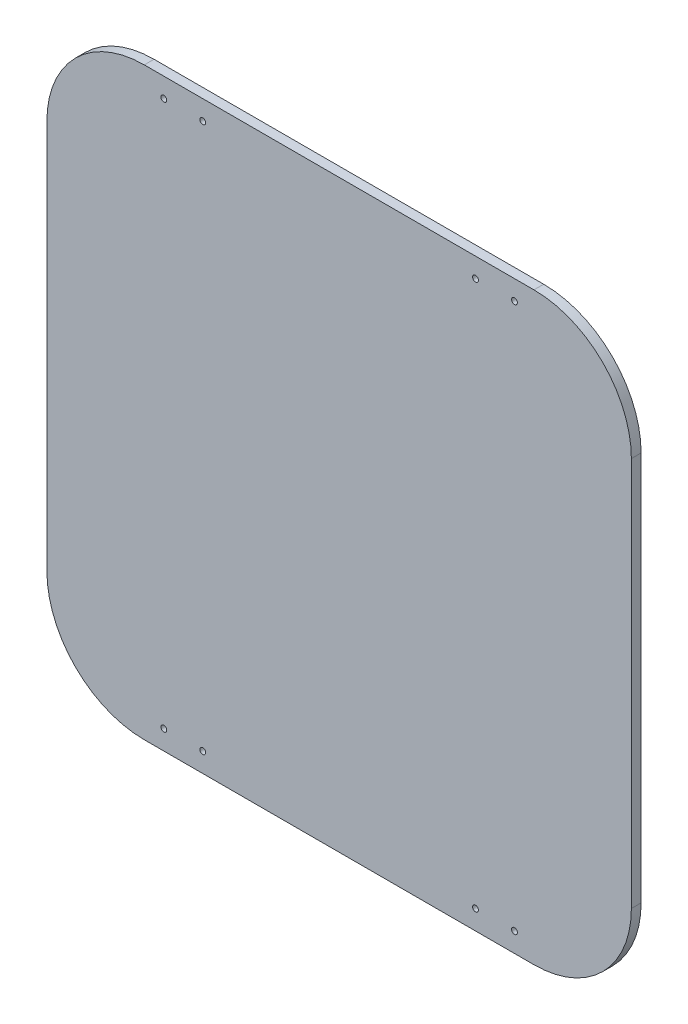
ISO-10303-21;
HEADER;
FILE_DESCRIPTION(('STEP AP214'),'2;1');
FILE_NAME('part.step','',(''),(''),'','','');
FILE_SCHEMA(('AUTOMOTIVE_DESIGN { 1 0 10303 214 1 1 1 1 }'));
ENDSEC;
DATA;
#1=APPLICATION_CONTEXT('core data for automotive mechanical design processes');
#2=APPLICATION_PROTOCOL_DEFINITION('international standard','automotive_design',2000,#1);
#3=PRODUCT_CONTEXT('',#1,'mechanical');
#4=PRODUCT('Part','Part','',(#3));
#5=PRODUCT_RELATED_PRODUCT_CATEGORY('part','',(#4));
#6=PRODUCT_DEFINITION_FORMATION('','',#4);
#7=PRODUCT_DEFINITION_CONTEXT('part definition',#1,'design');
#8=PRODUCT_DEFINITION('design','',#6,#7);
#9=PRODUCT_DEFINITION_SHAPE('','',#8);
#10=(LENGTH_UNIT() NAMED_UNIT(*) SI_UNIT(.MILLI.,.METRE.));
#11=(NAMED_UNIT(*) PLANE_ANGLE_UNIT() SI_UNIT($,.RADIAN.));
#12=(NAMED_UNIT(*) SI_UNIT($,.STERADIAN.) SOLID_ANGLE_UNIT());
#13=UNCERTAINTY_MEASURE_WITH_UNIT(LENGTH_MEASURE(1.E-05),#10,'distance_accuracy_value','');
#14=(GEOMETRIC_REPRESENTATION_CONTEXT(3) GLOBAL_UNCERTAINTY_ASSIGNED_CONTEXT((#13)) GLOBAL_UNIT_ASSIGNED_CONTEXT((#10,
#11,#12)) REPRESENTATION_CONTEXT('',''));
#15=CARTESIAN_POINT('',(0.,0.,0.));
#16=DIRECTION('',(0.,0.,1.));
#17=DIRECTION('',(1.,0.,0.));
#18=AXIS2_PLACEMENT_3D('',#15,#16,#17);
#19=CARTESIAN_POINT('',(-100.,-99.9999999999999,5.));
#20=DIRECTION('',(0.,0.,1.));
#21=DIRECTION('',(1.,0.,0.));
#22=AXIS2_PLACEMENT_3D('',#19,#20,#21);
#23=PLANE('',#22);
#24=CARTESIAN_POINT('',(-89.9999999999999,-140.,5.));
#25=DIRECTION('',(0.,0.,1.));
#26=DIRECTION('',(1.,0.,0.));
#27=AXIS2_PLACEMENT_3D('',#24,#25,#26);
#28=CIRCLE('',#27,1.5);
#29=CARTESIAN_POINT('',(-88.4999999999999,-140.,5.));
#30=VERTEX_POINT('',#29);
#31=EDGE_CURVE('E213',#30,#30,#28,.T.);
#32=ORIENTED_EDGE('',*,*,#31,.F.);
#33=EDGE_LOOP('',(#32));
#34=FACE_BOUND('',#33,.T.);
#35=CARTESIAN_POINT('',(70.,-140.,5.));
#36=DIRECTION('',(0.,0.,1.));
#37=DIRECTION('',(1.,0.,0.));
#38=AXIS2_PLACEMENT_3D('',#35,#36,#37);
#39=CIRCLE('',#38,1.5);
#40=CARTESIAN_POINT('',(71.5,-140.,5.));
#41=VERTEX_POINT('',#40);
#42=EDGE_CURVE('E201',#41,#41,#39,.T.);
#43=ORIENTED_EDGE('',*,*,#42,.F.);
#44=EDGE_LOOP('',(#43));
#45=FACE_BOUND('',#44,.T.);
#46=CARTESIAN_POINT('',(70.,140.,5.));
#47=DIRECTION('',(0.,0.,1.));
#48=DIRECTION('',(1.,0.,0.));
#49=AXIS2_PLACEMENT_3D('',#46,#47,#48);
#50=CIRCLE('',#49,1.5);
#51=CARTESIAN_POINT('',(71.5,140.,5.));
#52=VERTEX_POINT('',#51);
#53=EDGE_CURVE('E189',#52,#52,#50,.T.);
#54=ORIENTED_EDGE('',*,*,#53,.F.);
#55=EDGE_LOOP('',(#54));
#56=FACE_BOUND('',#55,.T.);
#57=CARTESIAN_POINT('',(-69.9999999999999,140.,5.));
#58=DIRECTION('',(0.,0.,1.));
#59=DIRECTION('',(1.,0.,0.));
#60=AXIS2_PLACEMENT_3D('',#57,#58,#59);
#61=CIRCLE('',#60,1.5);
#62=CARTESIAN_POINT('',(-68.4999999999999,140.,5.));
#63=VERTEX_POINT('',#62);
#64=EDGE_CURVE('E135',#63,#63,#61,.T.);
#65=ORIENTED_EDGE('',*,*,#64,.F.);
#66=EDGE_LOOP('',(#65));
#67=FACE_BOUND('',#66,.T.);
#68=CARTESIAN_POINT('',(-100.,-99.9999999999999,5.));
#69=DIRECTION('',(0.,0.,1.));
#70=DIRECTION('',(1.,0.,0.));
#71=AXIS2_PLACEMENT_3D('',#68,#69,#70);
#72=CIRCLE('',#71,50.);
#73=CARTESIAN_POINT('',(-150.,-99.9999999999999,5.));
#74=VERTEX_POINT('',#73);
#75=CARTESIAN_POINT('',(-100.,-150.,5.));
#76=VERTEX_POINT('',#75);
#77=EDGE_CURVE('E146',#74,#76,#72,.T.);
#78=ORIENTED_EDGE('',*,*,#77,.T.);
#79=DIRECTION('',(1.,0.,0.));
#80=VECTOR('',#79,1.);
#81=CARTESIAN_POINT('',(-100.,-150.,5.));
#82=LINE('',#81,#80);
#83=CARTESIAN_POINT('',(100.,-150.,5.));
#84=VERTEX_POINT('',#83);
#85=EDGE_CURVE('E94',#76,#84,#82,.T.);
#86=ORIENTED_EDGE('',*,*,#85,.T.);
#87=CARTESIAN_POINT('',(100.,-99.9999999999999,5.));
#88=DIRECTION('',(0.,0.,1.));
#89=DIRECTION('',(1.,0.,0.));
#90=AXIS2_PLACEMENT_3D('',#87,#88,#89);
#91=CIRCLE('',#90,50.);
#92=CARTESIAN_POINT('',(150.,-99.9999999999999,5.));
#93=VERTEX_POINT('',#92);
#94=EDGE_CURVE('E161',#84,#93,#91,.T.);
#95=ORIENTED_EDGE('',*,*,#94,.T.);
#96=DIRECTION('',(0.,1.,0.));
#97=VECTOR('',#96,1.);
#98=CARTESIAN_POINT('',(150.,-99.9999999999999,5.));
#99=LINE('',#98,#97);
#100=CARTESIAN_POINT('',(150.,99.9999999999999,5.));
#101=VERTEX_POINT('',#100);
#102=EDGE_CURVE('E174',#93,#101,#99,.T.);
#103=ORIENTED_EDGE('',*,*,#102,.T.);
#104=CARTESIAN_POINT('',(100.,99.9999999999999,5.));
#105=DIRECTION('',(0.,0.,1.));
#106=DIRECTION('',(1.,0.,0.));
#107=AXIS2_PLACEMENT_3D('',#104,#105,#106);
#108=CIRCLE('',#107,50.);
#109=CARTESIAN_POINT('',(100.,150.,5.));
#110=VERTEX_POINT('',#109);
#111=EDGE_CURVE('E113',#101,#110,#108,.T.);
#112=ORIENTED_EDGE('',*,*,#111,.T.);
#113=DIRECTION('',(-1.,0.,0.));
#114=VECTOR('',#113,1.);
#115=CARTESIAN_POINT('',(100.,150.,5.));
#116=LINE('',#115,#114);
#117=CARTESIAN_POINT('',(-100.,150.,5.));
#118=VERTEX_POINT('',#117);
#119=EDGE_CURVE('E107',#110,#118,#116,.T.);
#120=ORIENTED_EDGE('',*,*,#119,.T.);
#121=CARTESIAN_POINT('',(-100.,99.9999999999999,5.));
#122=DIRECTION('',(0.,0.,1.));
#123=DIRECTION('',(1.,0.,0.));
#124=AXIS2_PLACEMENT_3D('',#121,#122,#123);
#125=CIRCLE('',#124,50.);
#126=CARTESIAN_POINT('',(-150.,99.9999999999999,5.));
#127=VERTEX_POINT('',#126);
#128=EDGE_CURVE('E111',#118,#127,#125,.T.);
#129=ORIENTED_EDGE('',*,*,#128,.T.);
#130=DIRECTION('',(0.,-1.,0.));
#131=VECTOR('',#130,1.);
#132=CARTESIAN_POINT('',(-150.,99.9999999999999,5.));
#133=LINE('',#132,#131);
#134=EDGE_CURVE('E51',#127,#74,#133,.T.);
#135=ORIENTED_EDGE('',*,*,#134,.T.);
#136=EDGE_LOOP('',(#78,#86,#95,#103,#112,#120,#129,#135));
#137=FACE_BOUND('',#136,.T.);
#138=CARTESIAN_POINT('',(-89.9999999999999,140.,5.));
#139=DIRECTION('',(0.,0.,1.));
#140=DIRECTION('',(1.,0.,0.));
#141=AXIS2_PLACEMENT_3D('',#138,#139,#140);
#142=CIRCLE('',#141,1.5);
#143=CARTESIAN_POINT('',(-88.4999999999999,140.,5.));
#144=VERTEX_POINT('',#143);
#145=EDGE_CURVE('E183',#144,#144,#142,.T.);
#146=ORIENTED_EDGE('',*,*,#145,.F.);
#147=EDGE_LOOP('',(#146));
#148=FACE_BOUND('',#147,.T.);
#149=CARTESIAN_POINT('',(90.,-140.,5.));
#150=DIRECTION('',(0.,0.,1.));
#151=DIRECTION('',(1.,0.,0.));
#152=AXIS2_PLACEMENT_3D('',#149,#150,#151);
#153=CIRCLE('',#152,1.5);
#154=CARTESIAN_POINT('',(91.5,-140.,5.));
#155=VERTEX_POINT('',#154);
#156=EDGE_CURVE('E195',#155,#155,#153,.T.);
#157=ORIENTED_EDGE('',*,*,#156,.F.);
#158=EDGE_LOOP('',(#157));
#159=FACE_BOUND('',#158,.T.);
#160=CARTESIAN_POINT('',(-69.9999999999999,-140.,5.));
#161=DIRECTION('',(0.,0.,1.));
#162=DIRECTION('',(1.,0.,0.));
#163=AXIS2_PLACEMENT_3D('',#160,#161,#162);
#164=CIRCLE('',#163,1.5);
#165=CARTESIAN_POINT('',(-68.4999999999999,-140.,5.));
#166=VERTEX_POINT('',#165);
#167=EDGE_CURVE('E207',#166,#166,#164,.T.);
#168=ORIENTED_EDGE('',*,*,#167,.F.);
#169=EDGE_LOOP('',(#168));
#170=FACE_BOUND('',#169,.T.);
#171=CARTESIAN_POINT('',(90.,140.,5.));
#172=DIRECTION('',(0.,0.,1.));
#173=DIRECTION('',(1.,0.,0.));
#174=AXIS2_PLACEMENT_3D('',#171,#172,#173);
#175=CIRCLE('',#174,1.5);
#176=CARTESIAN_POINT('',(91.5,140.,5.));
#177=VERTEX_POINT('',#176);
#178=EDGE_CURVE('E219',#177,#177,#175,.T.);
#179=ORIENTED_EDGE('',*,*,#178,.F.);
#180=EDGE_LOOP('',(#179));
#181=FACE_BOUND('',#180,.T.);
#182=ADVANCED_FACE('F34',(#34,#45,#56,#67,#137,#148,#159,#170,#181),#23,.T.);
#183=CARTESIAN_POINT('',(-100.,-99.9999999999999,0.));
#184=DIRECTION('',(0.,0.,1.));
#185=DIRECTION('',(1.,0.,0.));
#186=AXIS2_PLACEMENT_3D('',#183,#184,#185);
#187=PLANE('',#186);
#188=CARTESIAN_POINT('',(-100.,-99.9999999999999,0.));
#189=DIRECTION('',(0.,0.,1.));
#190=DIRECTION('',(1.,0.,0.));
#191=AXIS2_PLACEMENT_3D('',#188,#189,#190);
#192=CIRCLE('',#191,50.);
#193=CARTESIAN_POINT('',(-150.,-99.9999999999999,0.));
#194=VERTEX_POINT('',#193);
#195=CARTESIAN_POINT('',(-100.,-150.,0.));
#196=VERTEX_POINT('',#195);
#197=EDGE_CURVE('E131',#194,#196,#192,.T.);
#198=ORIENTED_EDGE('',*,*,#197,.F.);
#199=DIRECTION('',(0.,-1.,0.));
#200=VECTOR('',#199,1.);
#201=CARTESIAN_POINT('',(-150.,99.9999999999999,0.));
#202=LINE('',#201,#200);
#203=CARTESIAN_POINT('',(-150.,99.9999999999999,0.));
#204=VERTEX_POINT('',#203);
#205=EDGE_CURVE('E86',#204,#194,#202,.T.);
#206=ORIENTED_EDGE('',*,*,#205,.F.);
#207=CARTESIAN_POINT('',(-100.,99.9999999999999,0.));
#208=DIRECTION('',(0.,0.,1.));
#209=DIRECTION('',(1.,0.,0.));
#210=AXIS2_PLACEMENT_3D('',#207,#208,#209);
#211=CIRCLE('',#210,50.);
#212=CARTESIAN_POINT('',(-100.,150.,0.));
#213=VERTEX_POINT('',#212);
#214=EDGE_CURVE('E80',#213,#204,#211,.T.);
#215=ORIENTED_EDGE('',*,*,#214,.F.);
#216=DIRECTION('',(-1.,0.,0.));
#217=VECTOR('',#216,1.);
#218=CARTESIAN_POINT('',(100.,150.,0.));
#219=LINE('',#218,#217);
#220=CARTESIAN_POINT('',(100.,150.,0.));
#221=VERTEX_POINT('',#220);
#222=EDGE_CURVE('E121',#221,#213,#219,.T.);
#223=ORIENTED_EDGE('',*,*,#222,.F.);
#224=CARTESIAN_POINT('',(100.,99.9999999999999,0.));
#225=DIRECTION('',(0.,0.,1.));
#226=DIRECTION('',(1.,0.,0.));
#227=AXIS2_PLACEMENT_3D('',#224,#225,#226);
#228=CIRCLE('',#227,50.);
#229=CARTESIAN_POINT('',(150.,99.9999999999999,0.));
#230=VERTEX_POINT('',#229);
#231=EDGE_CURVE('E141',#230,#221,#228,.T.);
#232=ORIENTED_EDGE('',*,*,#231,.F.);
#233=DIRECTION('',(0.,1.,0.));
#234=VECTOR('',#233,1.);
#235=CARTESIAN_POINT('',(150.,-99.9999999999999,0.));
#236=LINE('',#235,#234);
#237=CARTESIAN_POINT('',(150.,-99.9999999999999,0.));
#238=VERTEX_POINT('',#237);
#239=EDGE_CURVE('E139',#238,#230,#236,.T.);
#240=ORIENTED_EDGE('',*,*,#239,.F.);
#241=CARTESIAN_POINT('',(100.,-99.9999999999999,0.));
#242=DIRECTION('',(0.,0.,1.));
#243=DIRECTION('',(1.,0.,0.));
#244=AXIS2_PLACEMENT_3D('',#241,#242,#243);
#245=CIRCLE('',#244,50.);
#246=CARTESIAN_POINT('',(100.,-150.,0.));
#247=VERTEX_POINT('',#246);
#248=EDGE_CURVE('E137',#247,#238,#245,.T.);
#249=ORIENTED_EDGE('',*,*,#248,.F.);
#250=DIRECTION('',(1.,0.,0.));
#251=VECTOR('',#250,1.);
#252=CARTESIAN_POINT('',(-100.,-150.,0.));
#253=LINE('',#252,#251);
#254=EDGE_CURVE('E134',#196,#247,#253,.T.);
#255=ORIENTED_EDGE('',*,*,#254,.F.);
#256=EDGE_LOOP('',(#198,#206,#215,#223,#232,#240,#249,#255));
#257=FACE_BOUND('',#256,.T.);
#258=CARTESIAN_POINT('',(-69.9999999999999,140.,0.));
#259=DIRECTION('',(0.,0.,1.));
#260=DIRECTION('',(1.,0.,0.));
#261=AXIS2_PLACEMENT_3D('',#258,#259,#260);
#262=CIRCLE('',#261,1.5);
#263=CARTESIAN_POINT('',(-68.4999999999999,140.,0.));
#264=VERTEX_POINT('',#263);
#265=EDGE_CURVE('E180',#264,#264,#262,.T.);
#266=ORIENTED_EDGE('',*,*,#265,.T.);
#267=EDGE_LOOP('',(#266));
#268=FACE_BOUND('',#267,.T.);
#269=CARTESIAN_POINT('',(-89.9999999999999,140.,0.));
#270=DIRECTION('',(0.,0.,1.));
#271=DIRECTION('',(1.,0.,0.));
#272=AXIS2_PLACEMENT_3D('',#269,#270,#271);
#273=CIRCLE('',#272,1.5);
#274=CARTESIAN_POINT('',(-88.4999999999999,140.,0.));
#275=VERTEX_POINT('',#274);
#276=EDGE_CURVE('E186',#275,#275,#273,.T.);
#277=ORIENTED_EDGE('',*,*,#276,.T.);
#278=EDGE_LOOP('',(#277));
#279=FACE_BOUND('',#278,.T.);
#280=CARTESIAN_POINT('',(70.,140.,0.));
#281=DIRECTION('',(0.,0.,1.));
#282=DIRECTION('',(1.,0.,0.));
#283=AXIS2_PLACEMENT_3D('',#280,#281,#282);
#284=CIRCLE('',#283,1.5);
#285=CARTESIAN_POINT('',(71.5,140.,0.));
#286=VERTEX_POINT('',#285);
#287=EDGE_CURVE('E192',#286,#286,#284,.T.);
#288=ORIENTED_EDGE('',*,*,#287,.T.);
#289=EDGE_LOOP('',(#288));
#290=FACE_BOUND('',#289,.T.);
#291=CARTESIAN_POINT('',(90.,-140.,0.));
#292=DIRECTION('',(0.,0.,1.));
#293=DIRECTION('',(1.,0.,0.));
#294=AXIS2_PLACEMENT_3D('',#291,#292,#293);
#295=CIRCLE('',#294,1.5);
#296=CARTESIAN_POINT('',(91.5,-140.,0.));
#297=VERTEX_POINT('',#296);
#298=EDGE_CURVE('E198',#297,#297,#295,.T.);
#299=ORIENTED_EDGE('',*,*,#298,.T.);
#300=EDGE_LOOP('',(#299));
#301=FACE_BOUND('',#300,.T.);
#302=CARTESIAN_POINT('',(70.,-140.,0.));
#303=DIRECTION('',(0.,0.,1.));
#304=DIRECTION('',(1.,0.,0.));
#305=AXIS2_PLACEMENT_3D('',#302,#303,#304);
#306=CIRCLE('',#305,1.5);
#307=CARTESIAN_POINT('',(71.5,-140.,0.));
#308=VERTEX_POINT('',#307);
#309=EDGE_CURVE('E204',#308,#308,#306,.T.);
#310=ORIENTED_EDGE('',*,*,#309,.T.);
#311=EDGE_LOOP('',(#310));
#312=FACE_BOUND('',#311,.T.);
#313=CARTESIAN_POINT('',(-69.9999999999999,-140.,0.));
#314=DIRECTION('',(0.,0.,1.));
#315=DIRECTION('',(1.,0.,0.));
#316=AXIS2_PLACEMENT_3D('',#313,#314,#315);
#317=CIRCLE('',#316,1.5);
#318=CARTESIAN_POINT('',(-68.4999999999999,-140.,0.));
#319=VERTEX_POINT('',#318);
#320=EDGE_CURVE('E210',#319,#319,#317,.T.);
#321=ORIENTED_EDGE('',*,*,#320,.T.);
#322=EDGE_LOOP('',(#321));
#323=FACE_BOUND('',#322,.T.);
#324=CARTESIAN_POINT('',(-89.9999999999999,-140.,0.));
#325=DIRECTION('',(0.,0.,1.));
#326=DIRECTION('',(1.,0.,0.));
#327=AXIS2_PLACEMENT_3D('',#324,#325,#326);
#328=CIRCLE('',#327,1.5);
#329=CARTESIAN_POINT('',(-88.4999999999999,-140.,0.));
#330=VERTEX_POINT('',#329);
#331=EDGE_CURVE('E216',#330,#330,#328,.T.);
#332=ORIENTED_EDGE('',*,*,#331,.T.);
#333=EDGE_LOOP('',(#332));
#334=FACE_BOUND('',#333,.T.);
#335=CARTESIAN_POINT('',(90.,140.,0.));
#336=DIRECTION('',(0.,0.,1.));
#337=DIRECTION('',(1.,0.,0.));
#338=AXIS2_PLACEMENT_3D('',#335,#336,#337);
#339=CIRCLE('',#338,1.5);
#340=CARTESIAN_POINT('',(91.5,140.,0.));
#341=VERTEX_POINT('',#340);
#342=EDGE_CURVE('E222',#341,#341,#339,.T.);
#343=ORIENTED_EDGE('',*,*,#342,.T.);
#344=EDGE_LOOP('',(#343));
#345=FACE_BOUND('',#344,.T.);
#346=ADVANCED_FACE('F165',(#257,#268,#279,#290,#301,#312,#323,#334,#345),#187,.F.);
#347=CARTESIAN_POINT('',(-100.,-99.9999999999999,5.));
#348=DIRECTION('',(0.,0.,-1.));
#349=DIRECTION('',(-1.,0.,0.));
#350=AXIS2_PLACEMENT_3D('',#347,#348,#349);
#351=CYLINDRICAL_SURFACE('',#350,50.);
#352=ORIENTED_EDGE('',*,*,#197,.T.);
#353=DIRECTION('',(0.,0.,-1.));
#354=VECTOR('',#353,1.);
#355=CARTESIAN_POINT('',(-100.,-150.,5.));
#356=LINE('',#355,#354);
#357=EDGE_CURVE('E11',#76,#196,#356,.T.);
#358=ORIENTED_EDGE('',*,*,#357,.F.);
#359=ORIENTED_EDGE('',*,*,#77,.F.);
#360=DIRECTION('',(0.,0.,-1.));
#361=VECTOR('',#360,1.);
#362=CARTESIAN_POINT('',(-150.,-99.9999999999999,5.));
#363=LINE('',#362,#361);
#364=EDGE_CURVE('E127',#74,#194,#363,.T.);
#365=ORIENTED_EDGE('',*,*,#364,.T.);
#366=EDGE_LOOP('',(#352,#358,#359,#365));
#367=FACE_BOUND('',#366,.T.);
#368=ADVANCED_FACE('F36',(#367),#351,.T.);
#369=CARTESIAN_POINT('',(-100.,-150.,5.));
#370=DIRECTION('',(0.,1.,0.));
#371=DIRECTION('',(0.,0.,1.));
#372=AXIS2_PLACEMENT_3D('',#369,#370,#371);
#373=PLANE('',#372);
#374=ORIENTED_EDGE('',*,*,#254,.T.);
#375=DIRECTION('',(0.,0.,-1.));
#376=VECTOR('',#375,1.);
#377=CARTESIAN_POINT('',(100.,-150.,5.));
#378=LINE('',#377,#376);
#379=EDGE_CURVE('E43',#84,#247,#378,.T.);
#380=ORIENTED_EDGE('',*,*,#379,.F.);
#381=ORIENTED_EDGE('',*,*,#85,.F.);
#382=ORIENTED_EDGE('',*,*,#357,.T.);
#383=EDGE_LOOP('',(#374,#380,#381,#382));
#384=FACE_BOUND('',#383,.T.);
#385=ADVANCED_FACE('F256',(#384),#373,.F.);
#386=CARTESIAN_POINT('',(100.,-99.9999999999999,5.));
#387=DIRECTION('',(0.,0.,-1.));
#388=DIRECTION('',(-1.,0.,0.));
#389=AXIS2_PLACEMENT_3D('',#386,#387,#388);
#390=CYLINDRICAL_SURFACE('',#389,50.);
#391=ORIENTED_EDGE('',*,*,#248,.T.);
#392=DIRECTION('',(0.,0.,-1.));
#393=VECTOR('',#392,1.);
#394=CARTESIAN_POINT('',(150.,-99.9999999999999,5.));
#395=LINE('',#394,#393);
#396=EDGE_CURVE('E153',#93,#238,#395,.T.);
#397=ORIENTED_EDGE('',*,*,#396,.F.);
#398=ORIENTED_EDGE('',*,*,#94,.F.);
#399=ORIENTED_EDGE('',*,*,#379,.T.);
#400=EDGE_LOOP('',(#391,#397,#398,#399));
#401=FACE_BOUND('',#400,.T.);
#402=ADVANCED_FACE('F159',(#401),#390,.T.);
#403=CARTESIAN_POINT('',(150.,-99.9999999999999,5.));
#404=DIRECTION('',(-1.,0.,0.));
#405=DIRECTION('',(0.,0.,1.));
#406=AXIS2_PLACEMENT_3D('',#403,#404,#405);
#407=PLANE('',#406);
#408=ORIENTED_EDGE('',*,*,#239,.T.);
#409=DIRECTION('',(0.,0.,-1.));
#410=VECTOR('',#409,1.);
#411=CARTESIAN_POINT('',(150.,99.9999999999999,5.));
#412=LINE('',#411,#410);
#413=EDGE_CURVE('E150',#101,#230,#412,.T.);
#414=ORIENTED_EDGE('',*,*,#413,.F.);
#415=ORIENTED_EDGE('',*,*,#102,.F.);
#416=ORIENTED_EDGE('',*,*,#396,.T.);
#417=EDGE_LOOP('',(#408,#414,#415,#416));
#418=FACE_BOUND('',#417,.T.);
#419=ADVANCED_FACE('F170',(#418),#407,.F.);
#420=CARTESIAN_POINT('',(100.,99.9999999999999,5.));
#421=DIRECTION('',(0.,0.,-1.));
#422=DIRECTION('',(-1.,0.,0.));
#423=AXIS2_PLACEMENT_3D('',#420,#421,#422);
#424=CYLINDRICAL_SURFACE('',#423,50.);
#425=ORIENTED_EDGE('',*,*,#231,.T.);
#426=DIRECTION('',(0.,0.,-1.));
#427=VECTOR('',#426,1.);
#428=CARTESIAN_POINT('',(100.,150.,5.));
#429=LINE('',#428,#427);
#430=EDGE_CURVE('E122',#110,#221,#429,.T.);
#431=ORIENTED_EDGE('',*,*,#430,.F.);
#432=ORIENTED_EDGE('',*,*,#111,.F.);
#433=ORIENTED_EDGE('',*,*,#413,.T.);
#434=EDGE_LOOP('',(#425,#431,#432,#433));
#435=FACE_BOUND('',#434,.T.);
#436=ADVANCED_FACE('F173',(#435),#424,.T.);
#437=CARTESIAN_POINT('',(100.,150.,5.));
#438=DIRECTION('',(0.,-1.,0.));
#439=DIRECTION('',(0.,0.,-1.));
#440=AXIS2_PLACEMENT_3D('',#437,#438,#439);
#441=PLANE('',#440);
#442=ORIENTED_EDGE('',*,*,#222,.T.);
#443=DIRECTION('',(0.,0.,-1.));
#444=VECTOR('',#443,1.);
#445=CARTESIAN_POINT('',(-100.,150.,5.));
#446=LINE('',#445,#444);
#447=EDGE_CURVE('E118',#118,#213,#446,.T.);
#448=ORIENTED_EDGE('',*,*,#447,.F.);
#449=ORIENTED_EDGE('',*,*,#119,.F.);
#450=ORIENTED_EDGE('',*,*,#430,.T.);
#451=EDGE_LOOP('',(#442,#448,#449,#450));
#452=FACE_BOUND('',#451,.T.);
#453=ADVANCED_FACE('F119',(#452),#441,.F.);
#454=CARTESIAN_POINT('',(-100.,99.9999999999999,5.));
#455=DIRECTION('',(0.,0.,-1.));
#456=DIRECTION('',(-1.,0.,0.));
#457=AXIS2_PLACEMENT_3D('',#454,#455,#456);
#458=CYLINDRICAL_SURFACE('',#457,50.);
#459=ORIENTED_EDGE('',*,*,#214,.T.);
#460=DIRECTION('',(0.,0.,-1.));
#461=VECTOR('',#460,1.);
#462=CARTESIAN_POINT('',(-150.,99.9999999999999,5.));
#463=LINE('',#462,#461);
#464=EDGE_CURVE('E123',#127,#204,#463,.T.);
#465=ORIENTED_EDGE('',*,*,#464,.F.);
#466=ORIENTED_EDGE('',*,*,#128,.F.);
#467=ORIENTED_EDGE('',*,*,#447,.T.);
#468=EDGE_LOOP('',(#459,#465,#466,#467));
#469=FACE_BOUND('',#468,.T.);
#470=ADVANCED_FACE('F125',(#469),#458,.T.);
#471=CARTESIAN_POINT('',(-150.,99.9999999999999,5.));
#472=DIRECTION('',(1.,0.,0.));
#473=DIRECTION('',(0.,0.,-1.));
#474=AXIS2_PLACEMENT_3D('',#471,#472,#473);
#475=PLANE('',#474);
#476=ORIENTED_EDGE('',*,*,#205,.T.);
#477=ORIENTED_EDGE('',*,*,#364,.F.);
#478=ORIENTED_EDGE('',*,*,#134,.F.);
#479=ORIENTED_EDGE('',*,*,#464,.T.);
#480=EDGE_LOOP('',(#476,#477,#478,#479));
#481=FACE_BOUND('',#480,.T.);
#482=ADVANCED_FACE('F244',(#481),#475,.F.);
#483=CARTESIAN_POINT('',(-69.9999999999999,140.,5.));
#484=DIRECTION('',(0.,0.,-1.));
#485=DIRECTION('',(-1.,0.,0.));
#486=AXIS2_PLACEMENT_3D('',#483,#484,#485);
#487=CYLINDRICAL_SURFACE('',#486,1.5);
#488=ORIENTED_EDGE('',*,*,#64,.T.);
#489=EDGE_LOOP('',(#488));
#490=FACE_BOUND('',#489,.T.);
#491=ORIENTED_EDGE('',*,*,#265,.F.);
#492=EDGE_LOOP('',(#491));
#493=FACE_BOUND('',#492,.T.);
#494=ADVANCED_FACE('F241',(#490,#493),#487,.F.);
#495=CARTESIAN_POINT('',(-89.9999999999999,140.,5.));
#496=DIRECTION('',(0.,0.,-1.));
#497=DIRECTION('',(-1.,0.,0.));
#498=AXIS2_PLACEMENT_3D('',#495,#496,#497);
#499=CYLINDRICAL_SURFACE('',#498,1.5);
#500=ORIENTED_EDGE('',*,*,#145,.T.);
#501=EDGE_LOOP('',(#500));
#502=FACE_BOUND('',#501,.T.);
#503=ORIENTED_EDGE('',*,*,#276,.F.);
#504=EDGE_LOOP('',(#503));
#505=FACE_BOUND('',#504,.T.);
#506=ADVANCED_FACE('F333',(#502,#505),#499,.F.);
#507=CARTESIAN_POINT('',(70.,140.,5.));
#508=DIRECTION('',(0.,0.,-1.));
#509=DIRECTION('',(-1.,0.,0.));
#510=AXIS2_PLACEMENT_3D('',#507,#508,#509);
#511=CYLINDRICAL_SURFACE('',#510,1.5);
#512=ORIENTED_EDGE('',*,*,#53,.T.);
#513=EDGE_LOOP('',(#512));
#514=FACE_BOUND('',#513,.T.);
#515=ORIENTED_EDGE('',*,*,#287,.F.);
#516=EDGE_LOOP('',(#515));
#517=FACE_BOUND('',#516,.T.);
#518=ADVANCED_FACE('F342',(#514,#517),#511,.F.);
#519=CARTESIAN_POINT('',(90.,-140.,5.));
#520=DIRECTION('',(0.,0.,-1.));
#521=DIRECTION('',(-1.,0.,0.));
#522=AXIS2_PLACEMENT_3D('',#519,#520,#521);
#523=CYLINDRICAL_SURFACE('',#522,1.5);
#524=ORIENTED_EDGE('',*,*,#156,.T.);
#525=EDGE_LOOP('',(#524));
#526=FACE_BOUND('',#525,.T.);
#527=ORIENTED_EDGE('',*,*,#298,.F.);
#528=EDGE_LOOP('',(#527));
#529=FACE_BOUND('',#528,.T.);
#530=ADVANCED_FACE('F351',(#526,#529),#523,.F.);
#531=CARTESIAN_POINT('',(70.,-140.,5.));
#532=DIRECTION('',(0.,0.,-1.));
#533=DIRECTION('',(-1.,0.,0.));
#534=AXIS2_PLACEMENT_3D('',#531,#532,#533);
#535=CYLINDRICAL_SURFACE('',#534,1.5);
#536=ORIENTED_EDGE('',*,*,#42,.T.);
#537=EDGE_LOOP('',(#536));
#538=FACE_BOUND('',#537,.T.);
#539=ORIENTED_EDGE('',*,*,#309,.F.);
#540=EDGE_LOOP('',(#539));
#541=FACE_BOUND('',#540,.T.);
#542=ADVANCED_FACE('F361',(#538,#541),#535,.F.);
#543=CARTESIAN_POINT('',(-69.9999999999999,-140.,5.));
#544=DIRECTION('',(0.,0.,-1.));
#545=DIRECTION('',(-1.,0.,0.));
#546=AXIS2_PLACEMENT_3D('',#543,#544,#545);
#547=CYLINDRICAL_SURFACE('',#546,1.5);
#548=ORIENTED_EDGE('',*,*,#167,.T.);
#549=EDGE_LOOP('',(#548));
#550=FACE_BOUND('',#549,.T.);
#551=ORIENTED_EDGE('',*,*,#320,.F.);
#552=EDGE_LOOP('',(#551));
#553=FACE_BOUND('',#552,.T.);
#554=ADVANCED_FACE('F371',(#550,#553),#547,.F.);
#555=CARTESIAN_POINT('',(-89.9999999999999,-140.,5.));
#556=DIRECTION('',(0.,0.,-1.));
#557=DIRECTION('',(-1.,0.,0.));
#558=AXIS2_PLACEMENT_3D('',#555,#556,#557);
#559=CYLINDRICAL_SURFACE('',#558,1.5);
#560=ORIENTED_EDGE('',*,*,#31,.T.);
#561=EDGE_LOOP('',(#560));
#562=FACE_BOUND('',#561,.T.);
#563=ORIENTED_EDGE('',*,*,#331,.F.);
#564=EDGE_LOOP('',(#563));
#565=FACE_BOUND('',#564,.T.);
#566=ADVANCED_FACE('F381',(#562,#565),#559,.F.);
#567=CARTESIAN_POINT('',(90.,140.,5.));
#568=DIRECTION('',(0.,0.,-1.));
#569=DIRECTION('',(-1.,0.,0.));
#570=AXIS2_PLACEMENT_3D('',#567,#568,#569);
#571=CYLINDRICAL_SURFACE('',#570,1.5);
#572=ORIENTED_EDGE('',*,*,#178,.T.);
#573=EDGE_LOOP('',(#572));
#574=FACE_BOUND('',#573,.T.);
#575=ORIENTED_EDGE('',*,*,#342,.F.);
#576=EDGE_LOOP('',(#575));
#577=FACE_BOUND('',#576,.T.);
#578=ADVANCED_FACE('F228',(#574,#577),#571,.F.);
#579=CLOSED_SHELL('',(#182,#346,#368,#385,#402,#419,#436,#453,#470,#482,#494,#506,#518,#530,
#542,#554,#566,#578));
#580=MANIFOLD_SOLID_BREP('B2',#579);
#581=ADVANCED_BREP_SHAPE_REPRESENTATION('',(#18,#580),#14);
#582=SHAPE_DEFINITION_REPRESENTATION(#9,#581);
ENDSEC;
END-ISO-10303-21;
